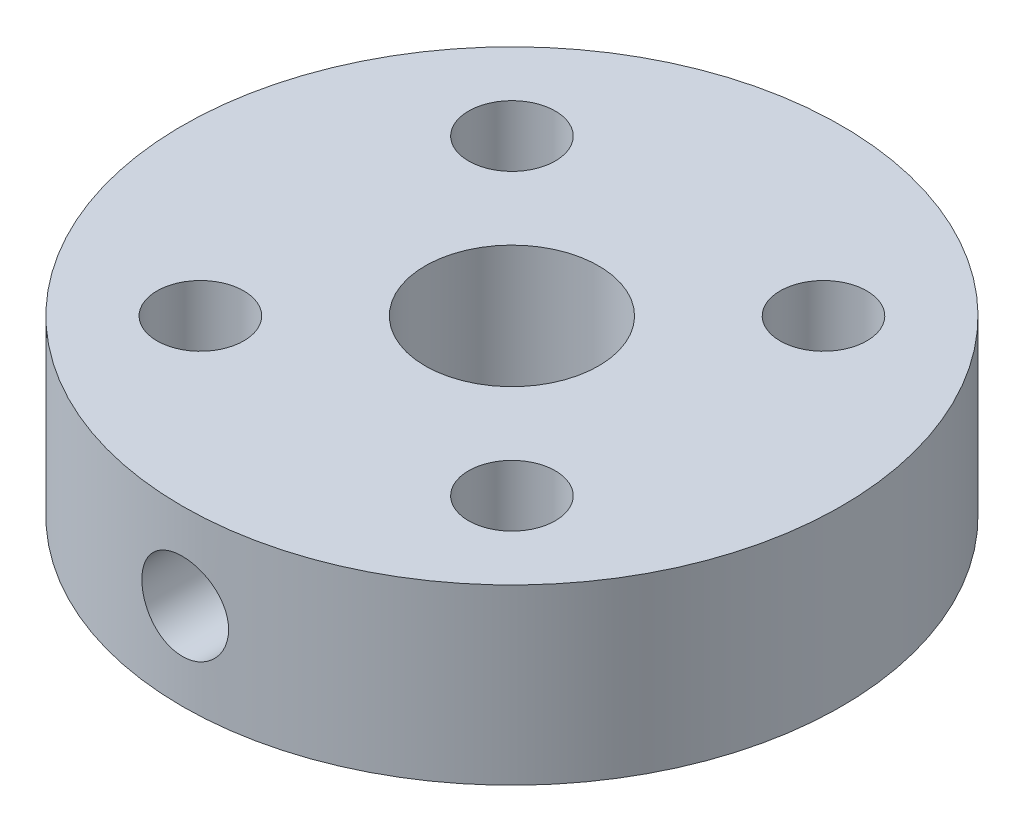
ISO-10303-21;
HEADER;
FILE_DESCRIPTION(('STEP AP214'),'2;1');
FILE_NAME('part.step','',(''),(''),'','','');
FILE_SCHEMA(('AUTOMOTIVE_DESIGN { 1 0 10303 214 1 1 1 1 }'));
ENDSEC;
DATA;
#1=APPLICATION_CONTEXT('core data for automotive mechanical design processes');
#2=APPLICATION_PROTOCOL_DEFINITION('international standard','automotive_design',2000,#1);
#3=PRODUCT_CONTEXT('',#1,'mechanical');
#4=PRODUCT('Part','Part','',(#3));
#5=PRODUCT_RELATED_PRODUCT_CATEGORY('part','',(#4));
#6=PRODUCT_DEFINITION_FORMATION('','',#4);
#7=PRODUCT_DEFINITION_CONTEXT('part definition',#1,'design');
#8=PRODUCT_DEFINITION('design','',#6,#7);
#9=PRODUCT_DEFINITION_SHAPE('','',#8);
#10=(LENGTH_UNIT() NAMED_UNIT(*) SI_UNIT(.MILLI.,.METRE.));
#11=(NAMED_UNIT(*) PLANE_ANGLE_UNIT() SI_UNIT($,.RADIAN.));
#12=(NAMED_UNIT(*) SI_UNIT($,.STERADIAN.) SOLID_ANGLE_UNIT());
#13=UNCERTAINTY_MEASURE_WITH_UNIT(LENGTH_MEASURE(1.E-05),#10,'distance_accuracy_value','');
#14=(GEOMETRIC_REPRESENTATION_CONTEXT(3) GLOBAL_UNCERTAINTY_ASSIGNED_CONTEXT((#13)) GLOBAL_UNIT_ASSIGNED_CONTEXT((#10,
#11,#12)) REPRESENTATION_CONTEXT('',''));
#15=CARTESIAN_POINT('',(0.,0.,0.));
#16=DIRECTION('',(0.,0.,1.));
#17=DIRECTION('',(1.,0.,0.));
#18=AXIS2_PLACEMENT_3D('',#15,#16,#17);
#19=CARTESIAN_POINT('',(0.,5.,0.));
#20=DIRECTION('',(0.,-1.,0.));
#21=DIRECTION('',(0.,0.,-1.));
#22=AXIS2_PLACEMENT_3D('',#19,#20,#21);
#23=CYLINDRICAL_SURFACE('',#22,9.5);
#24=CARTESIAN_POINT('',(1.24999999999999,2.5,9.41740410091868));
#25=CARTESIAN_POINT('',(1.24999704789294,2.43011379465119,9.41740515040742));
#26=CARTESIAN_POINT('',(1.24411931466305,2.36018467255548,9.41819043981181));
#27=CARTESIAN_POINT('',(1.22076605843336,2.22227477521103,9.42124533027014));
#28=CARTESIAN_POINT('',(1.20327861458071,2.15429607758202,9.42351645694713));
#29=CARTESIAN_POINT('',(1.15723232174961,2.02230357984593,9.42928142888536));
#30=CARTESIAN_POINT('',(1.12868122804134,1.95828703876486,9.43277441749336));
#31=CARTESIAN_POINT('',(1.0613351340311,1.83596492220363,9.44058851379835));
#32=CARTESIAN_POINT('',(1.02254180069082,1.77765841950909,9.44490948670654));
#33=CARTESIAN_POINT('',(0.935555536447491,1.66803949801496,9.45392261518461));
#34=CARTESIAN_POINT('',(0.88731182613636,1.61676752761631,9.45861669074954));
#35=CARTESIAN_POINT('',(0.782903691498044,1.52302277326857,9.46782988877771));
#36=CARTESIAN_POINT('',(0.72673886345977,1.48055043807805,9.47234900230879));
#37=CARTESIAN_POINT('',(0.607827237142832,1.40546437122733,9.48072286825033));
#38=CARTESIAN_POINT('',(0.545057022732172,1.37288742035882,9.48457511969083));
#39=CARTESIAN_POINT('',(0.414877343360042,1.31875255294734,9.49116007065744));
#40=CARTESIAN_POINT('',(0.347468068548598,1.29719418506955,9.49389281603899));
#41=CARTESIAN_POINT('',(0.210338313470634,1.265829777398,9.4979173195322));
#42=CARTESIAN_POINT('',(0.140633493799696,1.25595634411622,9.49921733795251));
#43=CARTESIAN_POINT('',(0.000545054460536045,1.2480331155322,9.50025814474571));
#44=CARTESIAN_POINT('',(-0.0698385356541861,1.24998280775371,9.49999900070088));
#45=CARTESIAN_POINT('',(-0.20882774781263,1.26559667926436,9.49795734365724));
#46=CARTESIAN_POINT('',(-0.27744167079196,1.27918837290105,9.4961842570123));
#47=CARTESIAN_POINT('',(-0.411406214346103,1.31758700356618,9.49132449458133));
#48=CARTESIAN_POINT('',(-0.476756767256531,1.3423941730349,9.48823779157073));
#49=CARTESIAN_POINT('',(-0.602562678419363,1.40259594273984,9.48108137373616));
#50=CARTESIAN_POINT('',(-0.663002955821203,1.43802170098394,9.47700877286313));
#51=CARTESIAN_POINT('',(-0.77710814406674,1.51843235628982,9.46833577460663));
#52=CARTESIAN_POINT('',(-0.830772710563958,1.56341773886709,9.46373535042145));
#53=CARTESIAN_POINT('',(-0.93022934908863,1.66207612684238,9.45447999803414));
#54=CARTESIAN_POINT('',(-0.975958735268477,1.7158123342479,9.44982492089106));
#55=CARTESIAN_POINT('',(-1.05775916328446,1.83023047618093,9.44101919770809));
#56=CARTESIAN_POINT('',(-1.09383016863953,1.89091243694228,9.43686855357354));
#57=CARTESIAN_POINT('',(-1.1552946873874,2.01755772705051,9.42954174057462));
#58=CARTESIAN_POINT('',(-1.18068283093785,2.0835236926697,9.42636606200229));
#59=CARTESIAN_POINT('',(-1.22000353371584,2.21883386407496,9.42135807082555));
#60=CARTESIAN_POINT('',(-1.23393670697446,2.28817788857281,9.41952568621592));
#61=CARTESIAN_POINT('',(-1.24986821658865,2.42772111469758,9.41742505133737));
#62=CARTESIAN_POINT('',(-1.25195492887754,2.49791005866249,9.41714521920936));
#63=CARTESIAN_POINT('',(-1.24436778967092,2.63763655644785,9.41815071410225));
#64=CARTESIAN_POINT('',(-1.23469421668077,2.70717412565477,9.41943600405816));
#65=CARTESIAN_POINT('',(-1.20393565087209,2.84335692266034,9.42341633828856));
#66=CARTESIAN_POINT('',(-1.18289375457381,2.91001205346481,9.42610605718738));
#67=CARTESIAN_POINT('',(-1.13004032110575,3.03884829537357,9.43258785218585));
#68=CARTESIAN_POINT('',(-1.09822836711487,3.10102923320538,9.43637997094961));
#69=CARTESIAN_POINT('',(-1.02452177647131,3.21955093973816,9.44466692307172));
#70=CARTESIAN_POINT('',(-0.982569368171468,3.27585549888484,9.44916572917076));
#71=CARTESIAN_POINT('',(-0.889854075114511,3.38065603112853,9.45834681086385));
#72=CARTESIAN_POINT('',(-0.839090809792216,3.42915166676215,9.46302909437602));
#73=CARTESIAN_POINT('',(-0.729807943556213,3.51726989431142,9.47208528996797));
#74=CARTESIAN_POINT('',(-0.671241214786122,3.55683429095804,9.47645705911991));
#75=CARTESIAN_POINT('',(-0.54824205618629,3.62556359939876,9.48436730464789));
#76=CARTESIAN_POINT('',(-0.483809755416958,3.65472873993871,9.48790579935237));
#77=CARTESIAN_POINT('',(-0.351098939428549,3.70173630666016,9.49374132443193));
#78=CARTESIAN_POINT('',(-0.282832344858819,3.71961191690473,9.49604199025897));
#79=CARTESIAN_POINT('',(-0.144234307708315,3.74364082577519,9.49915777375567));
#80=CARTESIAN_POINT('',(-0.0739029690011523,3.74979471307749,9.49997296602718));
#81=CARTESIAN_POINT('',(0.066260830819182,3.75019366185716,9.50002550419145));
#82=CARTESIAN_POINT('',(0.136093049401174,3.7445282840751,9.49927471634213));
#83=CARTESIAN_POINT('',(0.273803441283064,3.72163976918597,9.49630331821968));
#84=CARTESIAN_POINT('',(0.341681617009847,3.70441664643406,9.49408270977212));
#85=CARTESIAN_POINT('',(0.473542173562014,3.65893059252178,9.48842002745292));
#86=CARTESIAN_POINT('',(0.53752622321185,3.63067242947668,9.48497848119331));
#87=CARTESIAN_POINT('',(0.659858449122195,3.56392774970724,9.47725424463943));
#88=CARTESIAN_POINT('',(0.718206529238155,3.52544105853543,9.47297153999953));
#89=CARTESIAN_POINT('',(0.828067366506163,3.43900219469073,9.46400385926268));
#90=CARTESIAN_POINT('',(0.87952755276356,3.39098348067506,9.45931619411569));
#91=CARTESIAN_POINT('',(0.973693877727895,3.28698264817582,9.45008808874873));
#92=CARTESIAN_POINT('',(1.01639794604751,3.23099865158669,9.44554768356159));
#93=CARTESIAN_POINT('',(1.09199840888498,3.11237952083108,9.43710744957151));
#94=CARTESIAN_POINT('',(1.12485205925341,3.04971695441198,9.43321044460901));
#95=CARTESIAN_POINT('',(1.17952229042332,2.91974623395631,9.42653130552799));
#96=CARTESIAN_POINT('',(1.20135074085916,2.85244316497739,9.42374797311329));
#97=CARTESIAN_POINT('',(1.22819129159687,2.73733543112762,9.42027915781916));
#98=CARTESIAN_POINT('',(1.23635761509664,2.69025340647348,9.41920646480158));
#99=CARTESIAN_POINT('',(1.24726295373765,2.5954542589192,9.41776858101801));
#100=CARTESIAN_POINT('',(1.25000201649455,2.54773714159469,9.41740338404484));
#101=CARTESIAN_POINT('',(1.24999999999999,2.5,9.41740410091868));
#102=B_SPLINE_CURVE_WITH_KNOTS('',3,(#24,#25,#26,#27,#28,#29,#30,#31,#32,#33,#34,#35,#36,#37,
#38,#39,#40,#41,#42,#43,#44,#45,#46,#47,#48,#49,#50,#51,#52,#53,#54,#55,#56,#57,#58,#59,#60,#61,
#62,#63,#64,#65,#66,#67,#68,#69,#70,#71,#72,#73,#74,#75,#76,#77,#78,#79,#80,#81,#82,#83,#84,#85,
#86,#87,#88,#89,#90,#91,#92,#93,#94,#95,#96,#97,#98,#99,#100,#101),.UNSPECIFIED.,.T.,.F.,(4,2,2,
2,2,2,2,2,2,2,2,2,2,2,2,2,2,2,2,2,2,2,2,2,2,2,2,2,2,2,2,2,2,2,2,2,2,2,4),(0.,0.209484202571714,
0.419183836928697,0.628736743572665,0.838255565722021,1.04893269923856,1.25962057409929,
1.47108224647856,1.68253525643093,1.89276266234726,2.10298095597087,2.31189982011463,
2.52082301429179,2.73036535278697,2.93991833609115,3.15105801722778,3.36219849585733,
3.57344497984325,3.78468013945543,3.99433736908823,4.2039896337458,4.41285264161176,
4.62172373378566,4.83181406846403,5.04191347978167,5.25334471898745,5.4647713071873,
5.67557350690561,5.88636511965186,6.09556525763883,6.30476513579179,6.51387472089918,
6.7229878725974,6.93361567574768,7.14429322463348,7.35587216352334,7.56722283023418,
7.71031637390367,7.85340866214718),.UNSPECIFIED.);
#103=CARTESIAN_POINT('',(1.24999999999999,2.5,9.41740410091868));
#104=VERTEX_POINT('',#103);
#105=EDGE_CURVE('E10',#104,#104,#102,.T.);
#106=ORIENTED_EDGE('',*,*,#105,.T.);
#107=EDGE_LOOP('',(#106));
#108=FACE_BOUND('',#107,.T.);
#109=CARTESIAN_POINT('',(0.,5.,0.));
#110=DIRECTION('',(0.,1.,0.));
#111=DIRECTION('',(0.,0.,1.));
#112=AXIS2_PLACEMENT_3D('',#109,#110,#111);
#113=CIRCLE('',#112,9.5);
#114=CARTESIAN_POINT('',(0.,5.,9.5));
#115=VERTEX_POINT('',#114);
#116=EDGE_CURVE('E56',#115,#115,#113,.T.);
#117=ORIENTED_EDGE('',*,*,#116,.F.);
#118=EDGE_LOOP('',(#117));
#119=FACE_BOUND('',#118,.T.);
#120=CARTESIAN_POINT('',(0.,0.,0.));
#121=DIRECTION('',(0.,1.,0.));
#122=DIRECTION('',(0.,0.,1.));
#123=AXIS2_PLACEMENT_3D('',#120,#121,#122);
#124=CIRCLE('',#123,9.5);
#125=CARTESIAN_POINT('',(0.,0.,9.5));
#126=VERTEX_POINT('',#125);
#127=EDGE_CURVE('E60',#126,#126,#124,.T.);
#128=ORIENTED_EDGE('',*,*,#127,.T.);
#129=EDGE_LOOP('',(#128));
#130=FACE_BOUND('',#129,.T.);
#131=ADVANCED_FACE('F45',(#108,#119,#130),#23,.T.);
#132=CARTESIAN_POINT('',(0.,5.,0.));
#133=DIRECTION('',(0.,1.,0.));
#134=DIRECTION('',(0.,0.,1.));
#135=AXIS2_PLACEMENT_3D('',#132,#133,#134);
#136=PLANE('',#135);
#137=CARTESIAN_POINT('',(4.49012806053457,5.,-4.49012806053459));
#138=DIRECTION('',(0.,1.,0.));
#139=DIRECTION('',(0.,0.,1.));
#140=AXIS2_PLACEMENT_3D('',#137,#138,#139);
#141=CIRCLE('',#140,1.25);
#142=CARTESIAN_POINT('',(4.49012806053457,5.,-3.24012806053459));
#143=VERTEX_POINT('',#142);
#144=EDGE_CURVE('E93',#143,#143,#141,.T.);
#145=ORIENTED_EDGE('',*,*,#144,.F.);
#146=EDGE_LOOP('',(#145));
#147=FACE_BOUND('',#146,.T.);
#148=CARTESIAN_POINT('',(-4.4901280605346,5.,-4.49012806053455));
#149=DIRECTION('',(0.,1.,0.));
#150=DIRECTION('',(0.,0.,1.));
#151=AXIS2_PLACEMENT_3D('',#148,#149,#150);
#152=CIRCLE('',#151,1.25);
#153=CARTESIAN_POINT('',(-4.4901280605346,5.,-3.24012806053455));
#154=VERTEX_POINT('',#153);
#155=EDGE_CURVE('E87',#154,#154,#152,.T.);
#156=ORIENTED_EDGE('',*,*,#155,.F.);
#157=EDGE_LOOP('',(#156));
#158=FACE_BOUND('',#157,.T.);
#159=CARTESIAN_POINT('',(-4.49012806053457,5.,4.49012806053459));
#160=DIRECTION('',(0.,1.,0.));
#161=DIRECTION('',(0.,0.,1.));
#162=AXIS2_PLACEMENT_3D('',#159,#160,#161);
#163=CIRCLE('',#162,1.25);
#164=CARTESIAN_POINT('',(-4.49012806053457,5.,5.74012806053458));
#165=VERTEX_POINT('',#164);
#166=EDGE_CURVE('E81',#165,#165,#163,.T.);
#167=ORIENTED_EDGE('',*,*,#166,.F.);
#168=EDGE_LOOP('',(#167));
#169=FACE_BOUND('',#168,.T.);
#170=CARTESIAN_POINT('',(4.4901280605346,5.,4.49012806053455));
#171=DIRECTION('',(0.,1.,0.));
#172=DIRECTION('',(0.,0.,1.));
#173=AXIS2_PLACEMENT_3D('',#170,#171,#172);
#174=CIRCLE('',#173,1.25);
#175=CARTESIAN_POINT('',(4.4901280605346,5.,5.74012806053455));
#176=VERTEX_POINT('',#175);
#177=EDGE_CURVE('E75',#176,#176,#174,.T.);
#178=ORIENTED_EDGE('',*,*,#177,.F.);
#179=EDGE_LOOP('',(#178));
#180=FACE_BOUND('',#179,.T.);
#181=CARTESIAN_POINT('',(0.,5.,0.));
#182=DIRECTION('',(0.,1.,0.));
#183=DIRECTION('',(0.,0.,1.));
#184=AXIS2_PLACEMENT_3D('',#181,#182,#183);
#185=CIRCLE('',#184,2.5);
#186=CARTESIAN_POINT('',(0.,5.,2.5));
#187=VERTEX_POINT('',#186);
#188=EDGE_CURVE('E69',#187,#187,#185,.T.);
#189=ORIENTED_EDGE('',*,*,#188,.F.);
#190=EDGE_LOOP('',(#189));
#191=FACE_BOUND('',#190,.T.);
#192=ORIENTED_EDGE('',*,*,#116,.T.);
#193=EDGE_LOOP('',(#192));
#194=FACE_BOUND('',#193,.T.);
#195=ADVANCED_FACE('F134',(#147,#158,#169,#180,#191,#194),#136,.T.);
#196=CARTESIAN_POINT('',(0.,0.,0.));
#197=DIRECTION('',(0.,1.,0.));
#198=DIRECTION('',(0.,0.,1.));
#199=AXIS2_PLACEMENT_3D('',#196,#197,#198);
#200=PLANE('',#199);
#201=CARTESIAN_POINT('',(4.49012806053457,0.,-4.49012806053459));
#202=DIRECTION('',(0.,1.,0.));
#203=DIRECTION('',(0.,0.,1.));
#204=AXIS2_PLACEMENT_3D('',#201,#202,#203);
#205=CIRCLE('',#204,1.25);
#206=CARTESIAN_POINT('',(4.49012806053457,0.,-3.24012806053459));
#207=VERTEX_POINT('',#206);
#208=EDGE_CURVE('E90',#207,#207,#205,.T.);
#209=ORIENTED_EDGE('',*,*,#208,.T.);
#210=EDGE_LOOP('',(#209));
#211=FACE_BOUND('',#210,.T.);
#212=CARTESIAN_POINT('',(-4.4901280605346,0.,-4.49012806053455));
#213=DIRECTION('',(0.,1.,0.));
#214=DIRECTION('',(0.,0.,1.));
#215=AXIS2_PLACEMENT_3D('',#212,#213,#214);
#216=CIRCLE('',#215,1.25);
#217=CARTESIAN_POINT('',(-4.4901280605346,0.,-3.24012806053455));
#218=VERTEX_POINT('',#217);
#219=EDGE_CURVE('E84',#218,#218,#216,.T.);
#220=ORIENTED_EDGE('',*,*,#219,.T.);
#221=EDGE_LOOP('',(#220));
#222=FACE_BOUND('',#221,.T.);
#223=CARTESIAN_POINT('',(-4.49012806053457,0.,4.49012806053459));
#224=DIRECTION('',(0.,1.,0.));
#225=DIRECTION('',(0.,0.,1.));
#226=AXIS2_PLACEMENT_3D('',#223,#224,#225);
#227=CIRCLE('',#226,1.25);
#228=CARTESIAN_POINT('',(-4.49012806053457,0.,5.74012806053458));
#229=VERTEX_POINT('',#228);
#230=EDGE_CURVE('E78',#229,#229,#227,.T.);
#231=ORIENTED_EDGE('',*,*,#230,.T.);
#232=EDGE_LOOP('',(#231));
#233=FACE_BOUND('',#232,.T.);
#234=CARTESIAN_POINT('',(4.4901280605346,0.,4.49012806053455));
#235=DIRECTION('',(0.,1.,0.));
#236=DIRECTION('',(0.,0.,1.));
#237=AXIS2_PLACEMENT_3D('',#234,#235,#236);
#238=CIRCLE('',#237,1.25);
#239=CARTESIAN_POINT('',(4.4901280605346,0.,5.74012806053455));
#240=VERTEX_POINT('',#239);
#241=EDGE_CURVE('E72',#240,#240,#238,.T.);
#242=ORIENTED_EDGE('',*,*,#241,.T.);
#243=EDGE_LOOP('',(#242));
#244=FACE_BOUND('',#243,.T.);
#245=CARTESIAN_POINT('',(0.,0.,0.));
#246=DIRECTION('',(0.,1.,0.));
#247=DIRECTION('',(0.,0.,1.));
#248=AXIS2_PLACEMENT_3D('',#245,#246,#247);
#249=CIRCLE('',#248,2.5);
#250=CARTESIAN_POINT('',(0.,0.,2.5));
#251=VERTEX_POINT('',#250);
#252=EDGE_CURVE('E65',#251,#251,#249,.T.);
#253=ORIENTED_EDGE('',*,*,#252,.T.);
#254=EDGE_LOOP('',(#253));
#255=FACE_BOUND('',#254,.T.);
#256=ORIENTED_EDGE('',*,*,#127,.F.);
#257=EDGE_LOOP('',(#256));
#258=FACE_BOUND('',#257,.T.);
#259=ADVANCED_FACE('F129',(#211,#222,#233,#244,#255,#258),#200,.F.);
#260=CARTESIAN_POINT('',(0.,5.,0.));
#261=DIRECTION('',(0.,1.,0.));
#262=DIRECTION('',(0.,0.,1.));
#263=AXIS2_PLACEMENT_3D('',#260,#261,#262);
#264=CYLINDRICAL_SURFACE('',#263,2.5);
#265=CARTESIAN_POINT('',(0.,1.25000000000001,2.5));
#266=CARTESIAN_POINT('',(0.0657149536912328,1.25000412789938,2.49999641755189));
#267=CARTESIAN_POINT('',(0.13150824962254,1.2552125914021,2.49738113774397));
#268=CARTESIAN_POINT('',(0.26115029408553,1.27581610042615,2.48717695046745));
#269=CARTESIAN_POINT('',(0.324995108391878,1.29123049124707,2.47957859786229));
#270=CARTESIAN_POINT('',(0.448666931100716,1.331492260771,2.46020349254139));
#271=CARTESIAN_POINT('',(0.508508503673973,1.35630298031002,2.448442989719));
#272=CARTESIAN_POINT('',(0.623090771008203,1.41446327670618,2.42182220644723));
#273=CARTESIAN_POINT('',(0.677831867487559,1.44781218031107,2.40696217041913));
#274=CARTESIAN_POINT('',(0.784384772202395,1.52439656185663,2.37445322822571));
#275=CARTESIAN_POINT('',(0.835819013902636,1.56810809904956,2.3566899890942));
#276=CARTESIAN_POINT('',(0.930974306083717,1.6631518490588,2.32074962808431));
#277=CARTESIAN_POINT('',(0.974689478883453,1.71448981471556,2.30257220261294));
#278=CARTESIAN_POINT('',(1.05656500056284,1.82810418690423,2.26623688996684));
#279=CARTESIAN_POINT('',(1.09403166943954,1.8909201229324,2.24818983712665));
#280=CARTESIAN_POINT('',(1.15771028361336,2.02295916998277,2.21607473465401));
#281=CARTESIAN_POINT('',(1.18393026870791,2.09217766090344,2.20200384508737));
#282=CARTESIAN_POINT('',(1.22266555273573,2.23083138177741,2.18072333797261));
#283=CARTESIAN_POINT('',(1.23590732135054,2.30000556508424,2.17315339479642));
#284=CARTESIAN_POINT('',(1.25053374163605,2.43997354722435,2.1647736243566));
#285=CARTESIAN_POINT('',(1.25193011046634,2.51076567608894,2.1639571167911));
#286=CARTESIAN_POINT('',(1.24335910896536,2.64285753039421,2.16888662821561));
#287=CARTESIAN_POINT('',(1.23473069942102,2.70428003902881,2.17385954577517));
#288=CARTESIAN_POINT('',(1.20867481132116,2.8246523867163,2.18845285917313));
#289=CARTESIAN_POINT('',(1.19124452987206,2.88360143163164,2.19807473539721));
#290=CARTESIAN_POINT('',(1.1477622254825,2.99903641570707,2.22109345515927));
#291=CARTESIAN_POINT('',(1.12151883389499,3.05543299848223,2.23457300829998));
#292=CARTESIAN_POINT('',(1.061302109585,3.16329286573751,2.26379255351755));
#293=CARTESIAN_POINT('',(1.02732530476558,3.21475391950011,2.27953355975238));
#294=CARTESIAN_POINT('',(0.947582568640979,3.31815156592903,2.31391447379107));
#295=CARTESIAN_POINT('',(0.900868072961596,3.36932109197019,2.33266887795933));
#296=CARTESIAN_POINT('',(0.799444473426711,3.46341927323862,2.36934529125509));
#297=CARTESIAN_POINT('',(0.744731570717851,3.50634399004235,2.38726689948501));
#298=CARTESIAN_POINT('',(0.625645632289805,3.58460707628715,2.42127484103705));
#299=CARTESIAN_POINT('',(0.560941989499256,3.61950059055717,2.43723730202509));
#300=CARTESIAN_POINT('',(0.425582769360992,3.67762128630376,2.46447351401553));
#301=CARTESIAN_POINT('',(0.354931970331592,3.70085773126895,2.47575098679441));
#302=CARTESIAN_POINT('',(0.215958114575874,3.73309425464584,2.49155417176795));
#303=CARTESIAN_POINT('',(0.147926913185403,3.74311404468347,2.4965617287664));
#304=CARTESIAN_POINT('',(0.0109744999366902,3.75183091391811,2.50091266823877));
#305=CARTESIAN_POINT('',(-0.0579462748373781,3.75053335704934,2.5002587340164));
#306=CARTESIAN_POINT('',(-0.189041214982492,3.73724163947655,2.49363990316801));
#307=CARTESIAN_POINT('',(-0.251324260062443,3.72608433408746,2.48809057110237));
#308=CARTESIAN_POINT('',(-0.373008615377395,3.69470241013114,2.47277714143524));
#309=CARTESIAN_POINT('',(-0.432409607113745,3.67447679193329,2.46301257917916));
#310=CARTESIAN_POINT('',(-0.54861076056208,3.62500191695853,2.43980314267087));
#311=CARTESIAN_POINT('',(-0.605287996257691,3.59551118735398,2.42626102212424));
#312=CARTESIAN_POINT('',(-0.713076702123649,3.52861558044244,2.39679967896386));
#313=CARTESIAN_POINT('',(-0.7641857872191,3.4912073317582,2.38087944457231));
#314=CARTESIAN_POINT('',(-0.864709611613314,3.4052994683339,2.34635276671831));
#315=CARTESIAN_POINT('',(-0.913465097280796,3.35607141443304,2.32763606060552));
#316=CARTESIAN_POINT('',(-1.00232040139155,3.25009356091336,2.29077989504843));
#317=CARTESIAN_POINT('',(-1.04241423211355,3.19333860147953,2.27264084226908));
#318=CARTESIAN_POINT('',(-1.11463489312212,3.0704454322496,2.23813990282585));
#319=CARTESIAN_POINT('',(-1.14628186984829,3.00398591723925,2.2219066207934));
#320=CARTESIAN_POINT('',(-1.19760353251725,2.86561241538434,2.19467590460158));
#321=CARTESIAN_POINT('',(-1.21729364485946,2.79370559187351,2.18367172800773));
#322=CARTESIAN_POINT('',(-1.24232710931209,2.65386222142319,2.16951876260834));
#323=CARTESIAN_POINT('',(-1.24886624550107,2.5862071832137,2.16571729325614));
#324=CARTESIAN_POINT('',(-1.25086144297598,2.45069116603659,2.16456693307719));
#325=CARTESIAN_POINT('',(-1.24632230828049,2.38283028907571,2.16721524534441));
#326=CARTESIAN_POINT('',(-1.22740765699032,2.25564562308498,2.17797327562531));
#327=CARTESIAN_POINT('',(-1.21401039292849,2.1961244123195,2.18553868102992));
#328=CARTESIAN_POINT('',(-1.1789691977808,2.08023985071912,2.20463770234897));
#329=CARTESIAN_POINT('',(-1.15732261394976,2.02387752238504,2.21617259462095));
#330=CARTESIAN_POINT('',(-1.10476968162585,1.91171893626674,2.2428566295566));
#331=CARTESIAN_POINT('',(-1.07333892227056,1.85621512271287,2.25819652995239));
#332=CARTESIAN_POINT('',(-1.00268871454579,1.75090682977427,2.29044164543238));
#333=CARTESIAN_POINT('',(-0.963465214048303,1.70110533685189,2.30734767243153));
#334=CARTESIAN_POINT('',(-0.872754158330794,1.60232252205298,2.34327903949141));
#335=CARTESIAN_POINT('',(-0.820355528762706,1.5541761220476,2.36231229139336));
#336=CARTESIAN_POINT('',(-0.707693507775342,1.46717127072046,2.3984719031886));
#337=CARTESIAN_POINT('',(-0.647425904070974,1.42831782571714,2.4155972326005));
#338=CARTESIAN_POINT('',(-0.519914496024927,1.36095454654725,2.44622511981379));
#339=CARTESIAN_POINT('',(-0.452624379918261,1.33251978823571,2.45970120703636));
#340=CARTESIAN_POINT('',(-0.313427626617733,1.28773979010132,2.48126676704332));
#341=CARTESIAN_POINT('',(-0.241534749528952,1.27136019146303,2.48937154216165));
#342=CARTESIAN_POINT('',(-0.140752433104226,1.25762823615519,2.49619327387079));
#343=CARTESIAN_POINT('',(-0.11270234929937,1.25477169892048,2.49761706674002));
#344=CARTESIAN_POINT('',(-0.0564396647589456,1.250956668104,2.49952121222331));
#345=CARTESIAN_POINT('',(-0.028227059559226,1.24999822691101,2.50000153879704));
#346=CARTESIAN_POINT('',(0.,1.25000000000001,2.5));
#347=B_SPLINE_CURVE_WITH_KNOTS('',3,(#265,#266,#267,#268,#269,#270,#271,#272,#273,#274,#275,
#276,#277,#278,#279,#280,#281,#282,#283,#284,#285,#286,#287,#288,#289,#290,#291,#292,#293,#294,
#295,#296,#297,#298,#299,#300,#301,#302,#303,#304,#305,#306,#307,#308,#309,#310,#311,#312,#313,
#314,#315,#316,#317,#318,#319,#320,#321,#322,#323,#324,#325,#326,#327,#328,#329,#330,#331,#332,
#333,#334,#335,#336,#337,#338,#339,#340,#341,#342,#343,#344,#345,#346),.UNSPECIFIED.,.T.,.F.,(4,
2,2,2,2,2,2,2,2,2,2,2,2,2,2,2,2,2,2,2,2,2,2,2,2,2,2,2,2,2,2,2,2,2,2,2,2,2,2,2,4),(0.,
0.197030321775365,0.394435187136495,0.59107769436537,0.787704700726956,0.996227198397606,
1.20490779706754,1.4297715803844,1.6544743487285,1.86572515175286,2.07676696661274,
2.2625714051165,2.44843504907097,2.63862800210608,2.82890651575276,3.04331176667347,
3.25781918248356,3.48228777768049,3.70657771140348,3.9122911308918,4.11790705639343,
4.3075863313265,4.49728652038662,4.69241070034871,4.88761813435422,5.10199513305521,
5.31651985769287,5.5414335269959,5.76605639925969,5.96911634372964,6.17208824825003,
6.35572412805225,6.53941910979594,6.73545570969514,6.93159451423694,7.15156553440619,
7.37165479220712,7.59330017078653,7.81431135781159,7.89894100172118,7.98357298143554),.UNSPECIFIED.);
#348=CARTESIAN_POINT('',(0.,1.25000000000001,2.5));
#349=VERTEX_POINT('',#348);
#350=EDGE_CURVE('E96',#349,#349,#347,.T.);
#351=ORIENTED_EDGE('',*,*,#350,.T.);
#352=EDGE_LOOP('',(#351));
#353=FACE_BOUND('',#352,.T.);
#354=ORIENTED_EDGE('',*,*,#252,.F.);
#355=EDGE_LOOP('',(#354));
#356=FACE_BOUND('',#355,.T.);
#357=ORIENTED_EDGE('',*,*,#188,.T.);
#358=EDGE_LOOP('',(#357));
#359=FACE_BOUND('',#358,.T.);
#360=ADVANCED_FACE('F102',(#353,#356,#359),#264,.F.);
#361=CARTESIAN_POINT('',(4.4901280605346,5.,4.49012806053455));
#362=DIRECTION('',(0.,1.,0.));
#363=DIRECTION('',(0.,0.,1.));
#364=AXIS2_PLACEMENT_3D('',#361,#362,#363);
#365=CYLINDRICAL_SURFACE('',#364,1.25);
#366=ORIENTED_EDGE('',*,*,#241,.F.);
#367=EDGE_LOOP('',(#366));
#368=FACE_BOUND('',#367,.T.);
#369=ORIENTED_EDGE('',*,*,#177,.T.);
#370=EDGE_LOOP('',(#369));
#371=FACE_BOUND('',#370,.T.);
#372=ADVANCED_FACE('F122',(#368,#371),#365,.F.);
#373=CARTESIAN_POINT('',(-4.49012806053457,5.,4.49012806053459));
#374=DIRECTION('',(0.,1.,0.));
#375=DIRECTION('',(0.,0.,1.));
#376=AXIS2_PLACEMENT_3D('',#373,#374,#375);
#377=CYLINDRICAL_SURFACE('',#376,1.25);
#378=ORIENTED_EDGE('',*,*,#230,.F.);
#379=EDGE_LOOP('',(#378));
#380=FACE_BOUND('',#379,.T.);
#381=ORIENTED_EDGE('',*,*,#166,.T.);
#382=EDGE_LOOP('',(#381));
#383=FACE_BOUND('',#382,.T.);
#384=ADVANCED_FACE('F119',(#380,#383),#377,.F.);
#385=CARTESIAN_POINT('',(-4.4901280605346,5.,-4.49012806053455));
#386=DIRECTION('',(0.,1.,0.));
#387=DIRECTION('',(0.,0.,1.));
#388=AXIS2_PLACEMENT_3D('',#385,#386,#387);
#389=CYLINDRICAL_SURFACE('',#388,1.25);
#390=ORIENTED_EDGE('',*,*,#219,.F.);
#391=EDGE_LOOP('',(#390));
#392=FACE_BOUND('',#391,.T.);
#393=ORIENTED_EDGE('',*,*,#155,.T.);
#394=EDGE_LOOP('',(#393));
#395=FACE_BOUND('',#394,.T.);
#396=ADVANCED_FACE('F115',(#392,#395),#389,.F.);
#397=CARTESIAN_POINT('',(4.49012806053457,5.,-4.49012806053459));
#398=DIRECTION('',(0.,1.,0.));
#399=DIRECTION('',(0.,0.,1.));
#400=AXIS2_PLACEMENT_3D('',#397,#398,#399);
#401=CYLINDRICAL_SURFACE('',#400,1.25);
#402=ORIENTED_EDGE('',*,*,#208,.F.);
#403=EDGE_LOOP('',(#402));
#404=FACE_BOUND('',#403,.T.);
#405=ORIENTED_EDGE('',*,*,#144,.T.);
#406=EDGE_LOOP('',(#405));
#407=FACE_BOUND('',#406,.T.);
#408=ADVANCED_FACE('F110',(#404,#407),#401,.F.);
#409=CARTESIAN_POINT('',(0.,2.5,9.5));
#410=DIRECTION('',(0.,0.,1.));
#411=DIRECTION('',(1.,0.,0.));
#412=AXIS2_PLACEMENT_3D('',#409,#410,#411);
#413=CYLINDRICAL_SURFACE('',#412,1.24999999999999);
#414=ORIENTED_EDGE('',*,*,#105,.F.);
#415=EDGE_LOOP('',(#414));
#416=FACE_BOUND('',#415,.T.);
#417=ORIENTED_EDGE('',*,*,#350,.F.);
#418=EDGE_LOOP('',(#417));
#419=FACE_BOUND('',#418,.T.);
#420=ADVANCED_FACE('F106',(#416,#419),#413,.F.);
#421=CLOSED_SHELL('',(#131,#195,#259,#360,#372,#384,#396,#408,#420));
#422=MANIFOLD_SOLID_BREP('B2',#421);
#423=ADVANCED_BREP_SHAPE_REPRESENTATION('',(#18,#422),#14);
#424=SHAPE_DEFINITION_REPRESENTATION(#9,#423);
ENDSEC;
END-ISO-10303-21;
